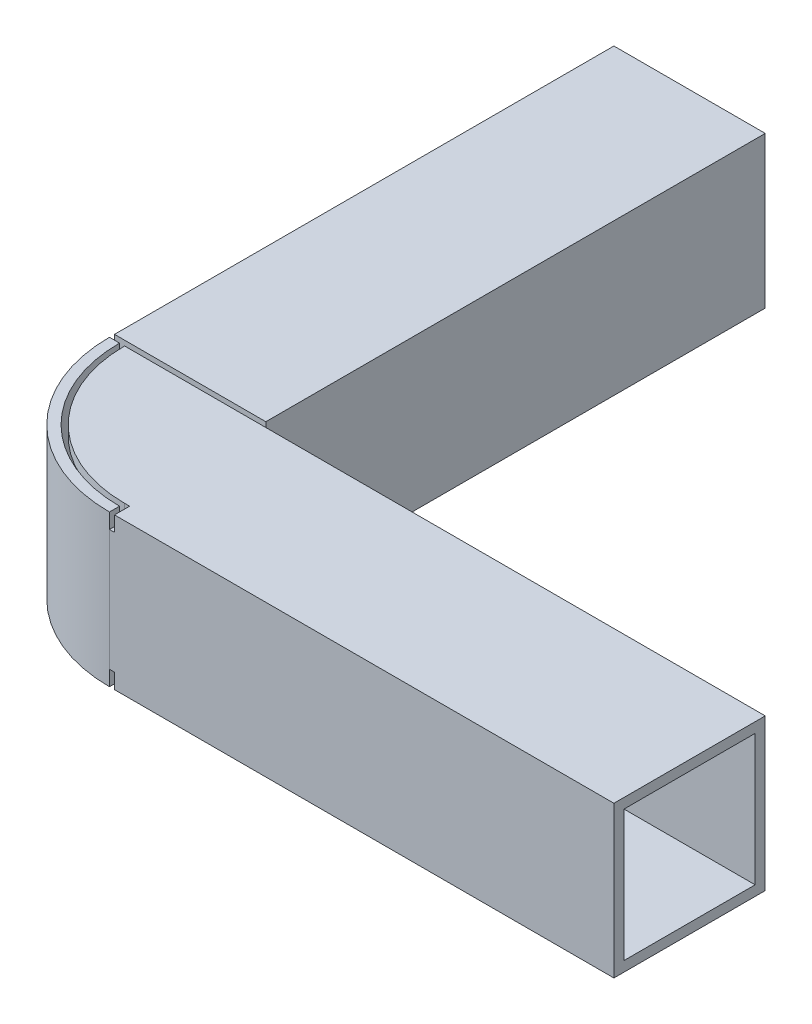
ISO-10303-21;
HEADER;
FILE_DESCRIPTION(('STEP AP214'),'2;1');
FILE_NAME('part.step','',(''),(''),'','','');
FILE_SCHEMA(('AUTOMOTIVE_DESIGN { 1 0 10303 214 1 1 1 1 }'));
ENDSEC;
DATA;
#1=APPLICATION_CONTEXT('core data for automotive mechanical design processes');
#2=APPLICATION_PROTOCOL_DEFINITION('international standard','automotive_design',2000,#1);
#3=PRODUCT_CONTEXT('',#1,'mechanical');
#4=PRODUCT('Part','Part','',(#3));
#5=PRODUCT_RELATED_PRODUCT_CATEGORY('part','',(#4));
#6=PRODUCT_DEFINITION_FORMATION('','',#4);
#7=PRODUCT_DEFINITION_CONTEXT('part definition',#1,'design');
#8=PRODUCT_DEFINITION('design','',#6,#7);
#9=PRODUCT_DEFINITION_SHAPE('','',#8);
#10=(LENGTH_UNIT() NAMED_UNIT(*) SI_UNIT(.MILLI.,.METRE.));
#11=(NAMED_UNIT(*) PLANE_ANGLE_UNIT() SI_UNIT($,.RADIAN.));
#12=(NAMED_UNIT(*) SI_UNIT($,.STERADIAN.) SOLID_ANGLE_UNIT());
#13=UNCERTAINTY_MEASURE_WITH_UNIT(LENGTH_MEASURE(1.E-05),#10,'distance_accuracy_value','');
#14=(GEOMETRIC_REPRESENTATION_CONTEXT(3) GLOBAL_UNCERTAINTY_ASSIGNED_CONTEXT((#13)) GLOBAL_UNIT_ASSIGNED_CONTEXT((#10,
#11,#12)) REPRESENTATION_CONTEXT('',''));
#15=CARTESIAN_POINT('',(0.,0.,0.));
#16=DIRECTION('',(0.,0.,1.));
#17=DIRECTION('',(1.,0.,0.));
#18=AXIS2_PLACEMENT_3D('',#15,#16,#17);
#19=CARTESIAN_POINT('',(-30.,15.,0.));
#20=DIRECTION('',(-1.,0.,0.));
#21=DIRECTION('',(0.,0.,1.));
#22=AXIS2_PLACEMENT_3D('',#19,#20,#21);
#23=PLANE('',#22);
#24=DIRECTION('',(0.,0.,-1.));
#25=VECTOR('',#24,1.);
#26=CARTESIAN_POINT('',(-30.,-15.,0.));
#27=LINE('',#26,#25);
#28=CARTESIAN_POINT('',(-30.,-15.,-0.999999999999996));
#29=VERTEX_POINT('',#28);
#30=CARTESIAN_POINT('',(-30.,-15.,-100.));
#31=VERTEX_POINT('',#30);
#32=EDGE_CURVE('E220',#29,#31,#27,.T.);
#33=ORIENTED_EDGE('',*,*,#32,.F.);
#34=DIRECTION('',(0.,-1.,0.));
#35=VECTOR('',#34,1.);
#36=CARTESIAN_POINT('',(-30.,-12.,-0.999999999999996));
#37=LINE('',#36,#35);
#38=CARTESIAN_POINT('',(-30.,-12.,-0.999999999999996));
#39=VERTEX_POINT('',#38);
#40=EDGE_CURVE('E571',#39,#29,#37,.T.);
#41=ORIENTED_EDGE('',*,*,#40,.F.);
#42=DIRECTION('',(0.,0.,1.));
#43=VECTOR('',#42,1.);
#44=CARTESIAN_POINT('',(-30.,-12.,0.));
#45=LINE('',#44,#43);
#46=CARTESIAN_POINT('',(-30.,-12.,0.));
#47=VERTEX_POINT('',#46);
#48=EDGE_CURVE('E546',#39,#47,#45,.T.);
#49=ORIENTED_EDGE('',*,*,#48,.T.);
#50=DIRECTION('',(0.,-1.,0.));
#51=VECTOR('',#50,1.);
#52=CARTESIAN_POINT('',(-30.,15.,0.));
#53=LINE('',#52,#51);
#54=CARTESIAN_POINT('',(-30.,12.,0.));
#55=VERTEX_POINT('',#54);
#56=EDGE_CURVE('E245',#47,#55,#53,.F.);
#57=ORIENTED_EDGE('',*,*,#56,.T.);
#58=DIRECTION('',(0.,0.,1.));
#59=VECTOR('',#58,1.);
#60=CARTESIAN_POINT('',(-30.,12.,0.));
#61=LINE('',#60,#59);
#62=CARTESIAN_POINT('',(-30.,12.,-0.999999999999996));
#63=VERTEX_POINT('',#62);
#64=EDGE_CURVE('E377',#63,#55,#61,.T.);
#65=ORIENTED_EDGE('',*,*,#64,.F.);
#66=DIRECTION('',(0.,1.,0.));
#67=VECTOR('',#66,1.);
#68=CARTESIAN_POINT('',(-30.,12.,-0.999999999999996));
#69=LINE('',#68,#67);
#70=CARTESIAN_POINT('',(-30.,15.,-0.999999999999996));
#71=VERTEX_POINT('',#70);
#72=EDGE_CURVE('E393',#63,#71,#69,.T.);
#73=ORIENTED_EDGE('',*,*,#72,.T.);
#74=DIRECTION('',(0.,0.,-1.));
#75=VECTOR('',#74,1.);
#76=CARTESIAN_POINT('',(-30.,15.,0.));
#77=LINE('',#76,#75);
#78=CARTESIAN_POINT('',(-30.,15.,-100.));
#79=VERTEX_POINT('',#78);
#80=EDGE_CURVE('E204',#71,#79,#77,.T.);
#81=ORIENTED_EDGE('',*,*,#80,.T.);
#82=DIRECTION('',(0.,-1.,0.));
#83=VECTOR('',#82,1.);
#84=CARTESIAN_POINT('',(-30.,15.,-100.));
#85=LINE('',#84,#83);
#86=EDGE_CURVE('E232',#79,#31,#85,.T.);
#87=ORIENTED_EDGE('',*,*,#86,.T.);
#88=EDGE_LOOP('',(#33,#41,#49,#57,#65,#73,#81,#87));
#89=FACE_BOUND('',#88,.T.);
#90=ADVANCED_FACE('F37',(#89),#23,.T.);
#91=CARTESIAN_POINT('',(0.,15.,30.));
#92=DIRECTION('',(0.,0.,1.));
#93=DIRECTION('',(1.,0.,0.));
#94=AXIS2_PLACEMENT_3D('',#91,#92,#93);
#95=PLANE('',#94);
#96=DIRECTION('',(1.,0.,0.));
#97=VECTOR('',#96,1.);
#98=CARTESIAN_POINT('',(1.,-12.,30.));
#99=LINE('',#98,#97);
#100=CARTESIAN_POINT('',(0.,-12.,30.));
#101=VERTEX_POINT('',#100);
#102=CARTESIAN_POINT('',(1.,-12.,30.));
#103=VERTEX_POINT('',#102);
#104=EDGE_CURVE('E360',#101,#103,#99,.T.);
#105=ORIENTED_EDGE('',*,*,#104,.T.);
#106=DIRECTION('',(0.,-1.,0.));
#107=VECTOR('',#106,1.);
#108=CARTESIAN_POINT('',(1.,-12.,30.));
#109=LINE('',#108,#107);
#110=CARTESIAN_POINT('',(1.,-15.,30.));
#111=VERTEX_POINT('',#110);
#112=EDGE_CURVE('E353',#103,#111,#109,.T.);
#113=ORIENTED_EDGE('',*,*,#112,.T.);
#114=DIRECTION('',(1.,0.,0.));
#115=VECTOR('',#114,1.);
#116=CARTESIAN_POINT('',(0.,-15.,30.));
#117=LINE('',#116,#115);
#118=CARTESIAN_POINT('',(100.,-15.,30.));
#119=VERTEX_POINT('',#118);
#120=EDGE_CURVE('E222',#119,#111,#117,.F.);
#121=ORIENTED_EDGE('',*,*,#120,.F.);
#122=DIRECTION('',(0.,-1.,0.));
#123=VECTOR('',#122,1.);
#124=CARTESIAN_POINT('',(100.,15.,30.));
#125=LINE('',#124,#123);
#126=CARTESIAN_POINT('',(100.,15.,30.));
#127=VERTEX_POINT('',#126);
#128=EDGE_CURVE('E230',#127,#119,#125,.T.);
#129=ORIENTED_EDGE('',*,*,#128,.F.);
#130=DIRECTION('',(1.,0.,0.));
#131=VECTOR('',#130,1.);
#132=CARTESIAN_POINT('',(0.,15.,30.));
#133=LINE('',#132,#131);
#134=CARTESIAN_POINT('',(1.,15.,30.));
#135=VERTEX_POINT('',#134);
#136=EDGE_CURVE('E206',#127,#135,#133,.F.);
#137=ORIENTED_EDGE('',*,*,#136,.T.);
#138=DIRECTION('',(0.,1.,0.));
#139=VECTOR('',#138,1.);
#140=CARTESIAN_POINT('',(1.,12.,30.));
#141=LINE('',#140,#139);
#142=CARTESIAN_POINT('',(1.,12.,30.));
#143=VERTEX_POINT('',#142);
#144=EDGE_CURVE('E407',#143,#135,#141,.T.);
#145=ORIENTED_EDGE('',*,*,#144,.F.);
#146=DIRECTION('',(1.,0.,0.));
#147=VECTOR('',#146,1.);
#148=CARTESIAN_POINT('',(1.,12.,30.));
#149=LINE('',#148,#147);
#150=CARTESIAN_POINT('',(0.,12.,30.));
#151=VERTEX_POINT('',#150);
#152=EDGE_CURVE('E400',#151,#143,#149,.T.);
#153=ORIENTED_EDGE('',*,*,#152,.F.);
#154=DIRECTION('',(0.,-1.,0.));
#155=VECTOR('',#154,1.);
#156=CARTESIAN_POINT('',(0.,15.,30.));
#157=LINE('',#156,#155);
#158=EDGE_CURVE('E238',#151,#101,#157,.T.);
#159=ORIENTED_EDGE('',*,*,#158,.T.);
#160=EDGE_LOOP('',(#105,#113,#121,#129,#137,#145,#153,#159));
#161=FACE_BOUND('',#160,.T.);
#162=ADVANCED_FACE('F587',(#161),#95,.T.);
#163=CARTESIAN_POINT('',(0.,-15.,0.));
#164=DIRECTION('',(0.,-1.,0.));
#165=DIRECTION('',(-1.,0.,0.));
#166=AXIS2_PLACEMENT_3D('',#163,#164,#165);
#167=PLANE('',#166);
#168=DIRECTION('',(-1.,0.,0.));
#169=VECTOR('',#168,1.);
#170=CARTESIAN_POINT('',(0.,-15.,-1.));
#171=LINE('',#170,#169);
#172=CARTESIAN_POINT('',(0.,-15.,-0.999999999999998));
#173=VERTEX_POINT('',#172);
#174=EDGE_CURVE('E427',#173,#29,#171,.T.);
#175=ORIENTED_EDGE('',*,*,#174,.T.);
#176=ORIENTED_EDGE('',*,*,#32,.T.);
#177=DIRECTION('',(1.,0.,0.));
#178=VECTOR('',#177,1.);
#179=CARTESIAN_POINT('',(-30.,-15.,-100.));
#180=LINE('',#179,#178);
#181=CARTESIAN_POINT('',(0.,-15.,-100.));
#182=VERTEX_POINT('',#181);
#183=EDGE_CURVE('E216',#31,#182,#180,.T.);
#184=ORIENTED_EDGE('',*,*,#183,.T.);
#185=DIRECTION('',(0.,0.,-1.));
#186=VECTOR('',#185,1.);
#187=CARTESIAN_POINT('',(0.,-15.,0.));
#188=LINE('',#187,#186);
#189=EDGE_CURVE('E214',#173,#182,#188,.T.);
#190=ORIENTED_EDGE('',*,*,#189,.F.);
#191=EDGE_LOOP('',(#175,#176,#184,#190));
#192=FACE_BOUND('',#191,.T.);
#193=ADVANCED_FACE('F616',(#192),#167,.T.);
#194=CARTESIAN_POINT('',(0.,-15.,0.));
#195=DIRECTION('',(0.,-1.,0.));
#196=DIRECTION('',(0.,0.,-1.));
#197=AXIS2_PLACEMENT_3D('',#194,#195,#196);
#198=CIRCLE('',#197,30.);
#199=CARTESIAN_POINT('',(0.,-15.,30.));
#200=VERTEX_POINT('',#199);
#201=CARTESIAN_POINT('',(-30.,-15.,0.));
#202=VERTEX_POINT('',#201);
#203=EDGE_CURVE('E242',#200,#202,#198,.T.);
#204=ORIENTED_EDGE('',*,*,#203,.T.);
#205=DIRECTION('',(1.,0.,0.));
#206=VECTOR('',#205,1.);
#207=CARTESIAN_POINT('',(-28.,-15.,0.));
#208=LINE('',#207,#206);
#209=CARTESIAN_POINT('',(-28.,-15.,0.));
#210=VERTEX_POINT('',#209);
#211=EDGE_CURVE('E553',#202,#210,#208,.T.);
#212=ORIENTED_EDGE('',*,*,#211,.T.);
#213=CARTESIAN_POINT('',(0.,-15.,0.));
#214=DIRECTION('',(0.,1.,0.));
#215=DIRECTION('',(0.,0.,1.));
#216=AXIS2_PLACEMENT_3D('',#213,#214,#215);
#217=CIRCLE('',#216,28.);
#218=CARTESIAN_POINT('',(1.88542757795229E-13,-15.,28.));
#219=VERTEX_POINT('',#218);
#220=EDGE_CURVE('E430',#210,#219,#217,.T.);
#221=ORIENTED_EDGE('',*,*,#220,.T.);
#222=DIRECTION('',(0.,0.,1.));
#223=VECTOR('',#222,1.);
#224=CARTESIAN_POINT('',(0.,-15.,30.));
#225=LINE('',#224,#223);
#226=EDGE_CURVE('E564',#219,#200,#225,.T.);
#227=ORIENTED_EDGE('',*,*,#226,.T.);
#228=EDGE_LOOP('',(#204,#212,#221,#227));
#229=FACE_BOUND('',#228,.T.);
#230=ADVANCED_FACE('F563',(#229),#167,.T.);
#231=DIRECTION('',(0.,0.,-1.));
#232=VECTOR('',#231,1.);
#233=CARTESIAN_POINT('',(0.999999999999999,-15.,27.));
#234=LINE('',#233,#232);
#235=CARTESIAN_POINT('',(0.999999999999999,-15.,27.));
#236=VERTEX_POINT('',#235);
#237=EDGE_CURVE('E579',#111,#236,#234,.T.);
#238=ORIENTED_EDGE('',*,*,#237,.T.);
#239=DIRECTION('',(-1.,0.,0.));
#240=VECTOR('',#239,1.);
#241=CARTESIAN_POINT('',(2.82814136692844E-13,-15.,27.));
#242=LINE('',#241,#240);
#243=CARTESIAN_POINT('',(2.82814136692844E-13,-15.,27.));
#244=VERTEX_POINT('',#243);
#245=EDGE_CURVE('E351',#236,#244,#242,.T.);
#246=ORIENTED_EDGE('',*,*,#245,.T.);
#247=CARTESIAN_POINT('',(0.,-15.,0.));
#248=DIRECTION('',(0.,1.,0.));
#249=DIRECTION('',(0.,0.,1.));
#250=AXIS2_PLACEMENT_3D('',#247,#248,#249);
#251=CIRCLE('',#250,27.);
#252=CARTESIAN_POINT('',(-27.,-15.,0.));
#253=VERTEX_POINT('',#252);
#254=EDGE_CURVE('E424',#253,#244,#251,.T.);
#255=ORIENTED_EDGE('',*,*,#254,.F.);
#256=DIRECTION('',(-1.,0.,0.));
#257=VECTOR('',#256,1.);
#258=CARTESIAN_POINT('',(0.,-15.,0.));
#259=LINE('',#258,#257);
#260=CARTESIAN_POINT('',(100.,-15.,0.));
#261=VERTEX_POINT('',#260);
#262=EDGE_CURVE('E201',#261,#253,#259,.T.);
#263=ORIENTED_EDGE('',*,*,#262,.F.);
#264=DIRECTION('',(0.,0.,1.));
#265=VECTOR('',#264,1.);
#266=CARTESIAN_POINT('',(100.,-15.,0.));
#267=LINE('',#266,#265);
#268=EDGE_CURVE('E225',#261,#119,#267,.T.);
#269=ORIENTED_EDGE('',*,*,#268,.T.);
#270=ORIENTED_EDGE('',*,*,#120,.T.);
#271=EDGE_LOOP('',(#238,#246,#255,#263,#269,#270));
#272=FACE_BOUND('',#271,.T.);
#273=ADVANCED_FACE('F582',(#272),#167,.T.);
#274=CARTESIAN_POINT('',(-28.,15.,0.));
#275=DIRECTION('',(-1.,0.,0.));
#276=DIRECTION('',(0.,0.,1.));
#277=AXIS2_PLACEMENT_3D('',#274,#275,#276);
#278=PLANE('',#277);
#279=DIRECTION('',(0.,-1.,0.));
#280=VECTOR('',#279,1.);
#281=CARTESIAN_POINT('',(-28.,-12.,-0.999999999999997));
#282=LINE('',#281,#280);
#283=CARTESIAN_POINT('',(-28.,-12.,-0.999999999999997));
#284=VERTEX_POINT('',#283);
#285=CARTESIAN_POINT('',(-28.,-13.,-0.999999999999997));
#286=VERTEX_POINT('',#285);
#287=EDGE_CURVE('E366',#284,#286,#282,.T.);
#288=ORIENTED_EDGE('',*,*,#287,.T.);
#289=DIRECTION('',(0.,0.,-1.));
#290=VECTOR('',#289,1.);
#291=CARTESIAN_POINT('',(-28.,-13.,0.));
#292=LINE('',#291,#290);
#293=CARTESIAN_POINT('',(-28.,-13.,-100.));
#294=VERTEX_POINT('',#293);
#295=EDGE_CURVE('E292',#286,#294,#292,.T.);
#296=ORIENTED_EDGE('',*,*,#295,.T.);
#297=DIRECTION('',(0.,-1.,0.));
#298=VECTOR('',#297,1.);
#299=CARTESIAN_POINT('',(-28.,15.,-100.));
#300=LINE('',#299,#298);
#301=CARTESIAN_POINT('',(-28.,13.,-100.));
#302=VERTEX_POINT('',#301);
#303=EDGE_CURVE('E186',#302,#294,#300,.T.);
#304=ORIENTED_EDGE('',*,*,#303,.F.);
#305=DIRECTION('',(0.,0.,-1.));
#306=VECTOR('',#305,1.);
#307=CARTESIAN_POINT('',(-28.,13.,0.));
#308=LINE('',#307,#306);
#309=CARTESIAN_POINT('',(-28.,13.,-0.999999999999997));
#310=VERTEX_POINT('',#309);
#311=EDGE_CURVE('E180',#310,#302,#308,.T.);
#312=ORIENTED_EDGE('',*,*,#311,.F.);
#313=DIRECTION('',(0.,1.,0.));
#314=VECTOR('',#313,1.);
#315=CARTESIAN_POINT('',(-28.,12.,-0.999999999999997));
#316=LINE('',#315,#314);
#317=CARTESIAN_POINT('',(-28.,12.,-0.999999999999997));
#318=VERTEX_POINT('',#317);
#319=EDGE_CURVE('E383',#318,#310,#316,.T.);
#320=ORIENTED_EDGE('',*,*,#319,.F.);
#321=DIRECTION('',(0.,0.,-1.));
#322=VECTOR('',#321,1.);
#323=CARTESIAN_POINT('',(-28.,12.,-0.999999999999997));
#324=LINE('',#323,#322);
#325=CARTESIAN_POINT('',(-28.,12.,0.));
#326=VERTEX_POINT('',#325);
#327=EDGE_CURVE('E370',#326,#318,#324,.T.);
#328=ORIENTED_EDGE('',*,*,#327,.F.);
#329=DIRECTION('',(0.,1.,0.));
#330=VECTOR('',#329,1.);
#331=CARTESIAN_POINT('',(-28.,15.,0.));
#332=LINE('',#331,#330);
#333=CARTESIAN_POINT('',(-28.,-12.,0.));
#334=VERTEX_POINT('',#333);
#335=EDGE_CURVE('E269',#334,#326,#332,.T.);
#336=ORIENTED_EDGE('',*,*,#335,.F.);
#337=DIRECTION('',(0.,0.,-1.));
#338=VECTOR('',#337,1.);
#339=CARTESIAN_POINT('',(-28.,-12.,-0.999999999999997));
#340=LINE('',#339,#338);
#341=EDGE_CURVE('E547',#334,#284,#340,.T.);
#342=ORIENTED_EDGE('',*,*,#341,.T.);
#343=EDGE_LOOP('',(#288,#296,#304,#312,#320,#328,#336,#342));
#344=FACE_BOUND('',#343,.T.);
#345=ADVANCED_FACE('F556',(#344),#278,.F.);
#346=CARTESIAN_POINT('',(0.,15.,28.));
#347=DIRECTION('',(0.,0.,1.));
#348=DIRECTION('',(1.,0.,0.));
#349=AXIS2_PLACEMENT_3D('',#346,#347,#348);
#350=PLANE('',#349);
#351=DIRECTION('',(0.,-1.,0.));
#352=VECTOR('',#351,1.);
#353=CARTESIAN_POINT('',(1.,15.,28.));
#354=LINE('',#353,#352);
#355=CARTESIAN_POINT('',(1.,-12.,28.));
#356=VERTEX_POINT('',#355);
#357=CARTESIAN_POINT('',(1.,-13.,28.));
#358=VERTEX_POINT('',#357);
#359=EDGE_CURVE('E324',#356,#358,#354,.T.);
#360=ORIENTED_EDGE('',*,*,#359,.F.);
#361=DIRECTION('',(-1.,0.,0.));
#362=VECTOR('',#361,1.);
#363=CARTESIAN_POINT('',(0.,-12.,28.));
#364=LINE('',#363,#362);
#365=CARTESIAN_POINT('',(1.88542757795229E-13,-12.,28.));
#366=VERTEX_POINT('',#365);
#367=EDGE_CURVE('E365',#356,#366,#364,.T.);
#368=ORIENTED_EDGE('',*,*,#367,.T.);
#369=DIRECTION('',(0.,1.,0.));
#370=VECTOR('',#369,1.);
#371=CARTESIAN_POINT('',(0.,15.,28.));
#372=LINE('',#371,#370);
#373=CARTESIAN_POINT('',(1.88542757795229E-13,12.,28.));
#374=VERTEX_POINT('',#373);
#375=EDGE_CURVE('E281',#374,#366,#372,.F.);
#376=ORIENTED_EDGE('',*,*,#375,.F.);
#377=DIRECTION('',(1.,0.,0.));
#378=VECTOR('',#377,1.);
#379=CARTESIAN_POINT('',(0.,12.,28.));
#380=LINE('',#379,#378);
#381=CARTESIAN_POINT('',(1.,12.,28.));
#382=VERTEX_POINT('',#381);
#383=EDGE_CURVE('E421',#374,#382,#380,.T.);
#384=ORIENTED_EDGE('',*,*,#383,.T.);
#385=DIRECTION('',(0.,1.,0.));
#386=VECTOR('',#385,1.);
#387=CARTESIAN_POINT('',(1.,15.,28.));
#388=LINE('',#387,#386);
#389=CARTESIAN_POINT('',(1.,13.,28.));
#390=VERTEX_POINT('',#389);
#391=EDGE_CURVE('E179',#382,#390,#388,.T.);
#392=ORIENTED_EDGE('',*,*,#391,.T.);
#393=DIRECTION('',(-1.,0.,0.));
#394=VECTOR('',#393,1.);
#395=CARTESIAN_POINT('',(0.,13.,28.));
#396=LINE('',#395,#394);
#397=CARTESIAN_POINT('',(100.,13.,28.));
#398=VERTEX_POINT('',#397);
#399=EDGE_CURVE('E165',#398,#390,#396,.T.);
#400=ORIENTED_EDGE('',*,*,#399,.F.);
#401=DIRECTION('',(0.,-1.,0.));
#402=VECTOR('',#401,1.);
#403=CARTESIAN_POINT('',(100.,15.,28.));
#404=LINE('',#403,#402);
#405=CARTESIAN_POINT('',(100.,-13.,28.));
#406=VERTEX_POINT('',#405);
#407=EDGE_CURVE('E176',#398,#406,#404,.T.);
#408=ORIENTED_EDGE('',*,*,#407,.T.);
#409=DIRECTION('',(-1.,0.,0.));
#410=VECTOR('',#409,1.);
#411=CARTESIAN_POINT('',(0.,-13.,28.));
#412=LINE('',#411,#410);
#413=EDGE_CURVE('E197',#406,#358,#412,.T.);
#414=ORIENTED_EDGE('',*,*,#413,.T.);
#415=EDGE_LOOP('',(#360,#368,#376,#384,#392,#400,#408,#414));
#416=FACE_BOUND('',#415,.T.);
#417=ADVANCED_FACE('F174',(#416),#350,.F.);
#418=CARTESIAN_POINT('',(0.,-13.,0.));
#419=DIRECTION('',(0.,-1.,0.));
#420=DIRECTION('',(-1.,0.,0.));
#421=AXIS2_PLACEMENT_3D('',#418,#419,#420);
#422=PLANE('',#421);
#423=DIRECTION('',(-1.,0.,0.));
#424=VECTOR('',#423,1.);
#425=CARTESIAN_POINT('',(0.,-13.,27.));
#426=LINE('',#425,#424);
#427=CARTESIAN_POINT('',(0.999999999999999,-13.,27.));
#428=VERTEX_POINT('',#427);
#429=CARTESIAN_POINT('',(1.33915127486763E-13,-13.,27.));
#430=VERTEX_POINT('',#429);
#431=EDGE_CURVE('E333',#428,#430,#426,.T.);
#432=ORIENTED_EDGE('',*,*,#431,.F.);
#433=DIRECTION('',(0.,0.,-1.));
#434=VECTOR('',#433,1.);
#435=CARTESIAN_POINT('',(0.999999999999995,-13.,0.));
#436=LINE('',#435,#434);
#437=EDGE_CURVE('E11',#358,#428,#436,.T.);
#438=ORIENTED_EDGE('',*,*,#437,.F.);
#439=ORIENTED_EDGE('',*,*,#413,.F.);
#440=DIRECTION('',(0.,0.,1.));
#441=VECTOR('',#440,1.);
#442=CARTESIAN_POINT('',(100.,-13.,0.));
#443=LINE('',#442,#441);
#444=CARTESIAN_POINT('',(100.,-13.,2.));
#445=VERTEX_POINT('',#444);
#446=EDGE_CURVE('E185',#445,#406,#443,.T.);
#447=ORIENTED_EDGE('',*,*,#446,.F.);
#448=DIRECTION('',(-1.,0.,0.));
#449=VECTOR('',#448,1.);
#450=CARTESIAN_POINT('',(0.,-13.,2.));
#451=LINE('',#450,#449);
#452=CARTESIAN_POINT('',(-2.,-13.,2.));
#453=VERTEX_POINT('',#452);
#454=EDGE_CURVE('E196',#445,#453,#451,.T.);
#455=ORIENTED_EDGE('',*,*,#454,.T.);
#456=DIRECTION('',(0.,0.,-1.));
#457=VECTOR('',#456,1.);
#458=CARTESIAN_POINT('',(-2.,-13.,0.));
#459=LINE('',#458,#457);
#460=CARTESIAN_POINT('',(-2.,-13.,0.));
#461=VERTEX_POINT('',#460);
#462=EDGE_CURVE('E293',#453,#461,#459,.T.);
#463=ORIENTED_EDGE('',*,*,#462,.T.);
#464=DIRECTION('',(1.,0.,0.));
#465=VECTOR('',#464,1.);
#466=CARTESIAN_POINT('',(0.,-13.,0.));
#467=LINE('',#466,#465);
#468=CARTESIAN_POINT('',(-27.,-13.,0.));
#469=VERTEX_POINT('',#468);
#470=EDGE_CURVE('E252',#469,#461,#467,.T.);
#471=ORIENTED_EDGE('',*,*,#470,.F.);
#472=CARTESIAN_POINT('',(0.,-13.,0.));
#473=DIRECTION('',(0.,-1.,0.));
#474=DIRECTION('',(0.,0.,-1.));
#475=AXIS2_PLACEMENT_3D('',#472,#473,#474);
#476=CIRCLE('',#475,27.);
#477=EDGE_CURVE('E254',#430,#469,#476,.T.);
#478=ORIENTED_EDGE('',*,*,#477,.F.);
#479=EDGE_LOOP('',(#432,#438,#439,#447,#455,#463,#471,#478));
#480=FACE_BOUND('',#479,.T.);
#481=ADVANCED_FACE('F330',(#480),#422,.F.);
#482=CARTESIAN_POINT('',(0.,15.,0.));
#483=DIRECTION('',(0.,-1.,0.));
#484=DIRECTION('',(-1.,0.,0.));
#485=AXIS2_PLACEMENT_3D('',#482,#483,#484);
#486=PLANE('',#485);
#487=CARTESIAN_POINT('',(0.,15.,0.));
#488=DIRECTION('',(0.,1.,0.));
#489=DIRECTION('',(0.,0.,1.));
#490=AXIS2_PLACEMENT_3D('',#487,#488,#489);
#491=CIRCLE('',#490,28.);
#492=CARTESIAN_POINT('',(-28.,15.,0.));
#493=VERTEX_POINT('',#492);
#494=CARTESIAN_POINT('',(1.88542757795229E-13,15.,28.));
#495=VERTEX_POINT('',#494);
#496=EDGE_CURVE('E259',#493,#495,#491,.T.);
#497=ORIENTED_EDGE('',*,*,#496,.F.);
#498=DIRECTION('',(1.,0.,0.));
#499=VECTOR('',#498,1.);
#500=CARTESIAN_POINT('',(-28.,15.,0.));
#501=LINE('',#500,#499);
#502=CARTESIAN_POINT('',(-30.,15.,0.));
#503=VERTEX_POINT('',#502);
#504=EDGE_CURVE('E374',#503,#493,#501,.T.);
#505=ORIENTED_EDGE('',*,*,#504,.F.);
#506=CARTESIAN_POINT('',(0.,15.,0.));
#507=DIRECTION('',(0.,-1.,0.));
#508=DIRECTION('',(0.,0.,-1.));
#509=AXIS2_PLACEMENT_3D('',#506,#507,#508);
#510=CIRCLE('',#509,30.);
#511=CARTESIAN_POINT('',(0.,15.,30.));
#512=VERTEX_POINT('',#511);
#513=EDGE_CURVE('E249',#503,#512,#510,.F.);
#514=ORIENTED_EDGE('',*,*,#513,.T.);
#515=DIRECTION('',(0.,0.,1.));
#516=VECTOR('',#515,1.);
#517=CARTESIAN_POINT('',(0.,15.,30.));
#518=LINE('',#517,#516);
#519=EDGE_CURVE('E410',#495,#512,#518,.T.);
#520=ORIENTED_EDGE('',*,*,#519,.F.);
#521=EDGE_LOOP('',(#497,#505,#514,#520));
#522=FACE_BOUND('',#521,.T.);
#523=ADVANCED_FACE('F658',(#522),#486,.F.);
#524=CARTESIAN_POINT('',(0.,15.,0.));
#525=DIRECTION('',(0.,1.,0.));
#526=DIRECTION('',(0.,0.,1.));
#527=AXIS2_PLACEMENT_3D('',#524,#525,#526);
#528=CIRCLE('',#527,27.);
#529=CARTESIAN_POINT('',(-27.,15.,0.));
#530=VERTEX_POINT('',#529);
#531=CARTESIAN_POINT('',(1.33915127486763E-13,15.,27.));
#532=VERTEX_POINT('',#531);
#533=EDGE_CURVE('E264',#530,#532,#528,.T.);
#534=ORIENTED_EDGE('',*,*,#533,.T.);
#535=DIRECTION('',(-1.,0.,0.));
#536=VECTOR('',#535,1.);
#537=CARTESIAN_POINT('',(2.82814136692844E-13,15.,27.));
#538=LINE('',#537,#536);
#539=CARTESIAN_POINT('',(0.999999999999999,15.,27.));
#540=VERTEX_POINT('',#539);
#541=EDGE_CURVE('E369',#540,#532,#538,.T.);
#542=ORIENTED_EDGE('',*,*,#541,.F.);
#543=DIRECTION('',(0.,0.,-1.));
#544=VECTOR('',#543,1.);
#545=CARTESIAN_POINT('',(0.999999999999999,15.,27.));
#546=LINE('',#545,#544);
#547=EDGE_CURVE('E401',#135,#540,#546,.T.);
#548=ORIENTED_EDGE('',*,*,#547,.F.);
#549=ORIENTED_EDGE('',*,*,#136,.F.);
#550=DIRECTION('',(0.,0.,1.));
#551=VECTOR('',#550,1.);
#552=CARTESIAN_POINT('',(100.,15.,0.));
#553=LINE('',#552,#551);
#554=CARTESIAN_POINT('',(100.,15.,0.));
#555=VERTEX_POINT('',#554);
#556=EDGE_CURVE('E209',#555,#127,#553,.T.);
#557=ORIENTED_EDGE('',*,*,#556,.F.);
#558=DIRECTION('',(-1.,0.,0.));
#559=VECTOR('',#558,1.);
#560=CARTESIAN_POINT('',(0.,15.,0.));
#561=LINE('',#560,#559);
#562=EDGE_CURVE('E68',#555,#530,#561,.T.);
#563=ORIENTED_EDGE('',*,*,#562,.T.);
#564=EDGE_LOOP('',(#534,#542,#548,#549,#557,#563));
#565=FACE_BOUND('',#564,.T.);
#566=ADVANCED_FACE('F670',(#565),#486,.F.);
#567=CARTESIAN_POINT('',(-2.,15.,0.));
#568=DIRECTION('',(-1.,0.,0.));
#569=DIRECTION('',(0.,0.,1.));
#570=AXIS2_PLACEMENT_3D('',#567,#568,#569);
#571=PLANE('',#570);
#572=DIRECTION('',(0.,0.,-1.));
#573=VECTOR('',#572,1.);
#574=CARTESIAN_POINT('',(-2.,13.,0.));
#575=LINE('',#574,#573);
#576=CARTESIAN_POINT('',(-2.,13.,2.));
#577=VERTEX_POINT('',#576);
#578=CARTESIAN_POINT('',(-2.,13.,0.));
#579=VERTEX_POINT('',#578);
#580=EDGE_CURVE('E297',#577,#579,#575,.T.);
#581=ORIENTED_EDGE('',*,*,#580,.T.);
#582=DIRECTION('',(0.,-1.,0.));
#583=VECTOR('',#582,1.);
#584=CARTESIAN_POINT('',(-2.,15.,0.));
#585=LINE('',#584,#583);
#586=EDGE_CURVE('E442',#579,#461,#585,.T.);
#587=ORIENTED_EDGE('',*,*,#586,.T.);
#588=ORIENTED_EDGE('',*,*,#462,.F.);
#589=DIRECTION('',(0.,-1.,0.));
#590=VECTOR('',#589,1.);
#591=CARTESIAN_POINT('',(-2.,15.,2.));
#592=LINE('',#591,#590);
#593=EDGE_CURVE('E192',#577,#453,#592,.T.);
#594=ORIENTED_EDGE('',*,*,#593,.F.);
#595=EDGE_LOOP('',(#581,#587,#588,#594));
#596=FACE_BOUND('',#595,.T.);
#597=ADVANCED_FACE('F695',(#596),#571,.T.);
#598=CARTESIAN_POINT('',(0.,13.,0.));
#599=DIRECTION('',(0.,-1.,0.));
#600=DIRECTION('',(-1.,0.,0.));
#601=AXIS2_PLACEMENT_3D('',#598,#599,#600);
#602=PLANE('',#601);
#603=DIRECTION('',(1.,0.,0.));
#604=VECTOR('',#603,1.);
#605=CARTESIAN_POINT('',(0.,13.,-1.));
#606=LINE('',#605,#604);
#607=CARTESIAN_POINT('',(-2.,13.,-1.));
#608=VERTEX_POINT('',#607);
#609=EDGE_CURVE('E452',#310,#608,#606,.T.);
#610=ORIENTED_EDGE('',*,*,#609,.F.);
#611=ORIENTED_EDGE('',*,*,#311,.T.);
#612=DIRECTION('',(1.,0.,0.));
#613=VECTOR('',#612,1.);
#614=CARTESIAN_POINT('',(0.,13.,-100.));
#615=LINE('',#614,#613);
#616=CARTESIAN_POINT('',(-2.,13.,-100.));
#617=VERTEX_POINT('',#616);
#618=EDGE_CURVE('E295',#302,#617,#615,.T.);
#619=ORIENTED_EDGE('',*,*,#618,.T.);
#620=EDGE_CURVE('E304',#608,#617,#575,.T.);
#621=ORIENTED_EDGE('',*,*,#620,.F.);
#622=EDGE_LOOP('',(#610,#611,#619,#621));
#623=FACE_BOUND('',#622,.T.);
#624=ADVANCED_FACE('F705',(#623),#602,.T.);
#625=ORIENTED_EDGE('',*,*,#295,.F.);
#626=DIRECTION('',(1.,0.,0.));
#627=VECTOR('',#626,1.);
#628=CARTESIAN_POINT('',(0.,-13.,-1.));
#629=LINE('',#628,#627);
#630=CARTESIAN_POINT('',(-2.,-13.,-1.));
#631=VERTEX_POINT('',#630);
#632=EDGE_CURVE('E256',#286,#631,#629,.T.);
#633=ORIENTED_EDGE('',*,*,#632,.T.);
#634=CARTESIAN_POINT('',(-2.,-13.,-100.));
#635=VERTEX_POINT('',#634);
#636=EDGE_CURVE('E266',#631,#635,#459,.T.);
#637=ORIENTED_EDGE('',*,*,#636,.T.);
#638=DIRECTION('',(1.,0.,0.));
#639=VECTOR('',#638,1.);
#640=CARTESIAN_POINT('',(0.,-13.,-100.));
#641=LINE('',#640,#639);
#642=EDGE_CURVE('E290',#294,#635,#641,.T.);
#643=ORIENTED_EDGE('',*,*,#642,.F.);
#644=EDGE_LOOP('',(#625,#633,#637,#643));
#645=FACE_BOUND('',#644,.T.);
#646=ADVANCED_FACE('F623',(#645),#422,.F.);
#647=CARTESIAN_POINT('',(-30.,15.,-100.));
#648=DIRECTION('',(0.,0.,-1.));
#649=DIRECTION('',(-1.,0.,0.));
#650=AXIS2_PLACEMENT_3D('',#647,#648,#649);
#651=PLANE('',#650);
#652=ORIENTED_EDGE('',*,*,#183,.F.);
#653=ORIENTED_EDGE('',*,*,#86,.F.);
#654=DIRECTION('',(1.,0.,0.));
#655=VECTOR('',#654,1.);
#656=CARTESIAN_POINT('',(-30.,15.,-100.));
#657=LINE('',#656,#655);
#658=CARTESIAN_POINT('',(0.,15.,-100.));
#659=VERTEX_POINT('',#658);
#660=EDGE_CURVE('E200',#79,#659,#657,.T.);
#661=ORIENTED_EDGE('',*,*,#660,.T.);
#662=DIRECTION('',(0.,-1.,0.));
#663=VECTOR('',#662,1.);
#664=CARTESIAN_POINT('',(0.,15.,-100.));
#665=LINE('',#664,#663);
#666=EDGE_CURVE('E235',#659,#182,#665,.T.);
#667=ORIENTED_EDGE('',*,*,#666,.T.);
#668=EDGE_LOOP('',(#652,#653,#661,#667));
#669=FACE_BOUND('',#668,.T.);
#670=ORIENTED_EDGE('',*,*,#303,.T.);
#671=ORIENTED_EDGE('',*,*,#642,.T.);
#672=DIRECTION('',(0.,-1.,0.));
#673=VECTOR('',#672,1.);
#674=CARTESIAN_POINT('',(-2.,15.,-100.));
#675=LINE('',#674,#673);
#676=EDGE_CURVE('E190',#617,#635,#675,.T.);
#677=ORIENTED_EDGE('',*,*,#676,.F.);
#678=ORIENTED_EDGE('',*,*,#618,.F.);
#679=EDGE_LOOP('',(#670,#671,#677,#678));
#680=FACE_BOUND('',#679,.T.);
#681=ADVANCED_FACE('F621',(#669,#680),#651,.T.);
#682=CARTESIAN_POINT('',(100.,15.,0.));
#683=DIRECTION('',(1.,0.,0.));
#684=DIRECTION('',(0.,0.,-1.));
#685=AXIS2_PLACEMENT_3D('',#682,#683,#684);
#686=PLANE('',#685);
#687=ORIENTED_EDGE('',*,*,#268,.F.);
#688=DIRECTION('',(0.,-1.,0.));
#689=VECTOR('',#688,1.);
#690=CARTESIAN_POINT('',(100.,15.,0.));
#691=LINE('',#690,#689);
#692=EDGE_CURVE('E213',#555,#261,#691,.T.);
#693=ORIENTED_EDGE('',*,*,#692,.F.);
#694=ORIENTED_EDGE('',*,*,#556,.T.);
#695=ORIENTED_EDGE('',*,*,#128,.T.);
#696=EDGE_LOOP('',(#687,#693,#694,#695));
#697=FACE_BOUND('',#696,.T.);
#698=DIRECTION('',(0.,-1.,0.));
#699=VECTOR('',#698,1.);
#700=CARTESIAN_POINT('',(100.,15.,2.));
#701=LINE('',#700,#699);
#702=CARTESIAN_POINT('',(100.,13.,2.));
#703=VERTEX_POINT('',#702);
#704=EDGE_CURVE('E187',#703,#445,#701,.T.);
#705=ORIENTED_EDGE('',*,*,#704,.T.);
#706=ORIENTED_EDGE('',*,*,#446,.T.);
#707=ORIENTED_EDGE('',*,*,#407,.F.);
#708=DIRECTION('',(0.,0.,1.));
#709=VECTOR('',#708,1.);
#710=CARTESIAN_POINT('',(100.,13.,0.));
#711=LINE('',#710,#709);
#712=EDGE_CURVE('E161',#703,#398,#711,.T.);
#713=ORIENTED_EDGE('',*,*,#712,.F.);
#714=EDGE_LOOP('',(#705,#706,#707,#713));
#715=FACE_BOUND('',#714,.T.);
#716=ADVANCED_FACE('F183',(#697,#715),#686,.T.);
#717=CARTESIAN_POINT('',(0.,15.,0.));
#718=DIRECTION('',(-1.,0.,0.));
#719=DIRECTION('',(0.,0.,1.));
#720=AXIS2_PLACEMENT_3D('',#717,#718,#719);
#721=PLANE('',#720);
#722=DIRECTION('',(0.,0.,-1.));
#723=VECTOR('',#722,1.);
#724=CARTESIAN_POINT('',(0.,15.,0.));
#725=LINE('',#724,#723);
#726=CARTESIAN_POINT('',(0.,15.,-0.999999999999998));
#727=VERTEX_POINT('',#726);
#728=EDGE_CURVE('E198',#727,#659,#725,.T.);
#729=ORIENTED_EDGE('',*,*,#728,.F.);
#730=DIRECTION('',(0.,1.,0.));
#731=VECTOR('',#730,1.);
#732=CARTESIAN_POINT('',(0.,-15.,-0.999999999999998));
#733=LINE('',#732,#731);
#734=EDGE_CURVE('E434',#173,#727,#733,.T.);
#735=ORIENTED_EDGE('',*,*,#734,.F.);
#736=ORIENTED_EDGE('',*,*,#189,.T.);
#737=ORIENTED_EDGE('',*,*,#666,.F.);
#738=EDGE_LOOP('',(#729,#735,#736,#737));
#739=FACE_BOUND('',#738,.T.);
#740=ADVANCED_FACE('F625',(#739),#721,.F.);
#741=CARTESIAN_POINT('',(0.,15.,0.));
#742=DIRECTION('',(0.,0.,1.));
#743=DIRECTION('',(1.,0.,0.));
#744=AXIS2_PLACEMENT_3D('',#741,#742,#743);
#745=PLANE('',#744);
#746=ORIENTED_EDGE('',*,*,#262,.T.);
#747=DIRECTION('',(0.,1.,0.));
#748=VECTOR('',#747,1.);
#749=CARTESIAN_POINT('',(-27.,-15.,0.));
#750=LINE('',#749,#748);
#751=EDGE_CURVE('E54',#253,#469,#750,.T.);
#752=ORIENTED_EDGE('',*,*,#751,.T.);
#753=ORIENTED_EDGE('',*,*,#470,.T.);
#754=ORIENTED_EDGE('',*,*,#586,.F.);
#755=DIRECTION('',(1.,0.,0.));
#756=VECTOR('',#755,1.);
#757=CARTESIAN_POINT('',(0.,13.,0.));
#758=LINE('',#757,#756);
#759=CARTESIAN_POINT('',(-27.,13.,0.));
#760=VERTEX_POINT('',#759);
#761=EDGE_CURVE('E447',#760,#579,#758,.T.);
#762=ORIENTED_EDGE('',*,*,#761,.F.);
#763=EDGE_CURVE('E433',#760,#530,#750,.T.);
#764=ORIENTED_EDGE('',*,*,#763,.T.);
#765=ORIENTED_EDGE('',*,*,#562,.F.);
#766=ORIENTED_EDGE('',*,*,#692,.T.);
#767=EDGE_LOOP('',(#746,#752,#753,#754,#762,#764,#765,#766));
#768=FACE_BOUND('',#767,.T.);
#769=ADVANCED_FACE('F627',(#768),#745,.F.);
#770=ORIENTED_EDGE('',*,*,#80,.F.);
#771=DIRECTION('',(1.,0.,0.));
#772=VECTOR('',#771,1.);
#773=CARTESIAN_POINT('',(0.,15.,-1.));
#774=LINE('',#773,#772);
#775=EDGE_CURVE('E263',#71,#727,#774,.T.);
#776=ORIENTED_EDGE('',*,*,#775,.T.);
#777=ORIENTED_EDGE('',*,*,#728,.T.);
#778=ORIENTED_EDGE('',*,*,#660,.F.);
#779=EDGE_LOOP('',(#770,#776,#777,#778));
#780=FACE_BOUND('',#779,.T.);
#781=ADVANCED_FACE('F633',(#780),#486,.F.);
#782=CARTESIAN_POINT('',(0.,15.,0.));
#783=DIRECTION('',(0.,-1.,0.));
#784=DIRECTION('',(0.,0.,-1.));
#785=AXIS2_PLACEMENT_3D('',#782,#783,#784);
#786=CYLINDRICAL_SURFACE('',#785,30.);
#787=ORIENTED_EDGE('',*,*,#513,.F.);
#788=DIRECTION('',(0.,1.,0.));
#789=VECTOR('',#788,1.);
#790=CARTESIAN_POINT('',(-30.,12.,0.));
#791=LINE('',#790,#789);
#792=EDGE_CURVE('E390',#55,#503,#791,.T.);
#793=ORIENTED_EDGE('',*,*,#792,.F.);
#794=ORIENTED_EDGE('',*,*,#56,.F.);
#795=EDGE_CURVE('E246',#202,#47,#53,.F.);
#796=ORIENTED_EDGE('',*,*,#795,.F.);
#797=ORIENTED_EDGE('',*,*,#203,.F.);
#798=DIRECTION('',(0.,-1.,0.));
#799=VECTOR('',#798,1.);
#800=CARTESIAN_POINT('',(0.,-12.,30.));
#801=LINE('',#800,#799);
#802=EDGE_CURVE('E357',#101,#200,#801,.T.);
#803=ORIENTED_EDGE('',*,*,#802,.F.);
#804=ORIENTED_EDGE('',*,*,#158,.F.);
#805=EDGE_CURVE('E239',#512,#151,#157,.T.);
#806=ORIENTED_EDGE('',*,*,#805,.F.);
#807=EDGE_LOOP('',(#787,#793,#794,#796,#797,#803,#804,#806));
#808=FACE_BOUND('',#807,.T.);
#809=ADVANCED_FACE('F39',(#808),#786,.T.);
#810=DIRECTION('',(0.,-1.,0.));
#811=VECTOR('',#810,1.);
#812=CARTESIAN_POINT('',(-2.,15.,-1.));
#813=LINE('',#812,#811);
#814=EDGE_CURVE('E450',#608,#631,#813,.T.);
#815=ORIENTED_EDGE('',*,*,#814,.F.);
#816=ORIENTED_EDGE('',*,*,#620,.T.);
#817=ORIENTED_EDGE('',*,*,#676,.T.);
#818=ORIENTED_EDGE('',*,*,#636,.F.);
#819=EDGE_LOOP('',(#815,#816,#817,#818));
#820=FACE_BOUND('',#819,.T.);
#821=ADVANCED_FACE('F690',(#820),#571,.T.);
#822=CARTESIAN_POINT('',(0.,15.,2.));
#823=DIRECTION('',(0.,0.,1.));
#824=DIRECTION('',(1.,0.,0.));
#825=AXIS2_PLACEMENT_3D('',#822,#823,#824);
#826=PLANE('',#825);
#827=ORIENTED_EDGE('',*,*,#454,.F.);
#828=ORIENTED_EDGE('',*,*,#704,.F.);
#829=DIRECTION('',(-1.,0.,0.));
#830=VECTOR('',#829,1.);
#831=CARTESIAN_POINT('',(0.,13.,2.));
#832=LINE('',#831,#830);
#833=EDGE_CURVE('E167',#703,#577,#832,.T.);
#834=ORIENTED_EDGE('',*,*,#833,.T.);
#835=ORIENTED_EDGE('',*,*,#593,.T.);
#836=EDGE_LOOP('',(#827,#828,#834,#835));
#837=FACE_BOUND('',#836,.T.);
#838=ADVANCED_FACE('F693',(#837),#826,.T.);
#839=DIRECTION('',(1.,0.,0.));
#840=VECTOR('',#839,1.);
#841=CARTESIAN_POINT('',(0.,13.,27.));
#842=LINE('',#841,#840);
#843=CARTESIAN_POINT('',(2.82814136692844E-13,13.,27.));
#844=VERTEX_POINT('',#843);
#845=CARTESIAN_POINT('',(0.999999999999999,13.,27.));
#846=VERTEX_POINT('',#845);
#847=EDGE_CURVE('E389',#844,#846,#842,.T.);
#848=ORIENTED_EDGE('',*,*,#847,.F.);
#849=CARTESIAN_POINT('',(0.,13.,0.));
#850=DIRECTION('',(0.,-1.,0.));
#851=DIRECTION('',(0.,0.,-1.));
#852=AXIS2_PLACEMENT_3D('',#849,#850,#851);
#853=CIRCLE('',#852,27.);
#854=EDGE_CURVE('E262',#844,#760,#853,.T.);
#855=ORIENTED_EDGE('',*,*,#854,.T.);
#856=ORIENTED_EDGE('',*,*,#761,.T.);
#857=ORIENTED_EDGE('',*,*,#580,.F.);
#858=ORIENTED_EDGE('',*,*,#833,.F.);
#859=ORIENTED_EDGE('',*,*,#712,.T.);
#860=ORIENTED_EDGE('',*,*,#399,.T.);
#861=DIRECTION('',(0.,0.,1.));
#862=VECTOR('',#861,1.);
#863=CARTESIAN_POINT('',(0.999999999999995,13.,0.));
#864=LINE('',#863,#862);
#865=EDGE_CURVE('E46',#846,#390,#864,.T.);
#866=ORIENTED_EDGE('',*,*,#865,.F.);
#867=EDGE_LOOP('',(#848,#855,#856,#857,#858,#859,#860,#866));
#868=FACE_BOUND('',#867,.T.);
#869=ADVANCED_FACE('F164',(#868),#602,.T.);
#870=CARTESIAN_POINT('',(0.,15.,0.));
#871=DIRECTION('',(0.,-1.,0.));
#872=DIRECTION('',(0.,0.,-1.));
#873=AXIS2_PLACEMENT_3D('',#870,#871,#872);
#874=CYLINDRICAL_SURFACE('',#873,28.);
#875=EDGE_CURVE('E217',#210,#334,#332,.T.);
#876=ORIENTED_EDGE('',*,*,#875,.T.);
#877=ORIENTED_EDGE('',*,*,#335,.T.);
#878=DIRECTION('',(0.,1.,0.));
#879=VECTOR('',#878,1.);
#880=CARTESIAN_POINT('',(-28.,12.,0.));
#881=LINE('',#880,#879);
#882=EDGE_CURVE('E387',#326,#493,#881,.T.);
#883=ORIENTED_EDGE('',*,*,#882,.T.);
#884=ORIENTED_EDGE('',*,*,#496,.T.);
#885=EDGE_CURVE('E274',#495,#374,#372,.F.);
#886=ORIENTED_EDGE('',*,*,#885,.T.);
#887=ORIENTED_EDGE('',*,*,#375,.T.);
#888=DIRECTION('',(0.,1.,0.));
#889=VECTOR('',#888,1.);
#890=CARTESIAN_POINT('',(1.3887494702331E-13,-15.,28.));
#891=LINE('',#890,#889);
#892=EDGE_CURVE('E436',#219,#366,#891,.T.);
#893=ORIENTED_EDGE('',*,*,#892,.F.);
#894=ORIENTED_EDGE('',*,*,#220,.F.);
#895=EDGE_LOOP('',(#876,#877,#883,#884,#886,#887,#893,#894));
#896=FACE_BOUND('',#895,.T.);
#897=ADVANCED_FACE('F559',(#896),#874,.F.);
#898=CARTESIAN_POINT('',(0.,-15.,0.));
#899=DIRECTION('',(0.,1.,0.));
#900=DIRECTION('',(0.,0.,1.));
#901=AXIS2_PLACEMENT_3D('',#898,#899,#900);
#902=CYLINDRICAL_SURFACE('',#901,27.);
#903=ORIENTED_EDGE('',*,*,#533,.F.);
#904=ORIENTED_EDGE('',*,*,#763,.F.);
#905=ORIENTED_EDGE('',*,*,#854,.F.);
#906=DIRECTION('',(0.,1.,0.));
#907=VECTOR('',#906,1.);
#908=CARTESIAN_POINT('',(1.33915127486763E-13,-15.,27.));
#909=LINE('',#908,#907);
#910=EDGE_CURVE('E439',#844,#532,#909,.T.);
#911=ORIENTED_EDGE('',*,*,#910,.T.);
#912=EDGE_LOOP('',(#903,#904,#905,#911));
#913=FACE_BOUND('',#912,.T.);
#914=ADVANCED_FACE('F462',(#913),#902,.T.);
#915=ORIENTED_EDGE('',*,*,#477,.T.);
#916=ORIENTED_EDGE('',*,*,#751,.F.);
#917=ORIENTED_EDGE('',*,*,#254,.T.);
#918=EDGE_CURVE('E440',#244,#430,#909,.T.);
#919=ORIENTED_EDGE('',*,*,#918,.T.);
#920=EDGE_LOOP('',(#915,#916,#917,#919));
#921=FACE_BOUND('',#920,.T.);
#922=ADVANCED_FACE('F687',(#921),#902,.T.);
#923=CARTESIAN_POINT('',(0.,-15.,-1.));
#924=DIRECTION('',(0.,0.,-1.));
#925=DIRECTION('',(-1.,0.,0.));
#926=AXIS2_PLACEMENT_3D('',#923,#924,#925);
#927=PLANE('',#926);
#928=ORIENTED_EDGE('',*,*,#775,.F.);
#929=ORIENTED_EDGE('',*,*,#72,.F.);
#930=DIRECTION('',(-1.,0.,0.));
#931=VECTOR('',#930,1.);
#932=CARTESIAN_POINT('',(-30.,12.,-0.999999999999996));
#933=LINE('',#932,#931);
#934=EDGE_CURVE('E373',#318,#63,#933,.T.);
#935=ORIENTED_EDGE('',*,*,#934,.F.);
#936=ORIENTED_EDGE('',*,*,#319,.T.);
#937=ORIENTED_EDGE('',*,*,#609,.T.);
#938=ORIENTED_EDGE('',*,*,#814,.T.);
#939=ORIENTED_EDGE('',*,*,#632,.F.);
#940=ORIENTED_EDGE('',*,*,#287,.F.);
#941=DIRECTION('',(-1.,0.,0.));
#942=VECTOR('',#941,1.);
#943=CARTESIAN_POINT('',(-30.,-12.,-0.999999999999996));
#944=LINE('',#943,#942);
#945=EDGE_CURVE('E551',#284,#39,#944,.T.);
#946=ORIENTED_EDGE('',*,*,#945,.T.);
#947=ORIENTED_EDGE('',*,*,#40,.T.);
#948=ORIENTED_EDGE('',*,*,#174,.F.);
#949=ORIENTED_EDGE('',*,*,#734,.T.);
#950=EDGE_LOOP('',(#928,#929,#935,#936,#937,#938,#939,#940,#946,#947,#948,#949));
#951=FACE_BOUND('',#950,.T.);
#952=ADVANCED_FACE('F644',(#951),#927,.F.);
#953=CARTESIAN_POINT('',(0.999999999999999,12.,27.));
#954=DIRECTION('',(1.,0.,0.));
#955=DIRECTION('',(0.,0.,-1.));
#956=AXIS2_PLACEMENT_3D('',#953,#954,#955);
#957=PLANE('',#956);
#958=DIRECTION('',(0.,0.,-1.));
#959=VECTOR('',#958,1.);
#960=CARTESIAN_POINT('',(0.999999999999999,12.,27.));
#961=LINE('',#960,#959);
#962=EDGE_CURVE('E404',#143,#382,#961,.T.);
#963=ORIENTED_EDGE('',*,*,#962,.F.);
#964=ORIENTED_EDGE('',*,*,#144,.T.);
#965=ORIENTED_EDGE('',*,*,#547,.T.);
#966=DIRECTION('',(0.,1.,0.));
#967=VECTOR('',#966,1.);
#968=CARTESIAN_POINT('',(0.999999999999999,12.,27.));
#969=LINE('',#968,#967);
#970=EDGE_CURVE('E386',#846,#540,#969,.T.);
#971=ORIENTED_EDGE('',*,*,#970,.F.);
#972=ORIENTED_EDGE('',*,*,#865,.T.);
#973=ORIENTED_EDGE('',*,*,#391,.F.);
#974=EDGE_LOOP('',(#963,#964,#965,#971,#972,#973));
#975=FACE_BOUND('',#974,.T.);
#976=ADVANCED_FACE('F667',(#975),#957,.F.);
#977=CARTESIAN_POINT('',(0.,12.,0.));
#978=DIRECTION('',(0.,-1.,0.));
#979=DIRECTION('',(0.,0.,-1.));
#980=AXIS2_PLACEMENT_3D('',#977,#978,#979);
#981=PLANE('',#980);
#982=DIRECTION('',(0.,0.,1.));
#983=VECTOR('',#982,1.);
#984=CARTESIAN_POINT('',(0.,12.,30.));
#985=LINE('',#984,#983);
#986=EDGE_CURVE('E397',#374,#151,#985,.T.);
#987=ORIENTED_EDGE('',*,*,#986,.T.);
#988=ORIENTED_EDGE('',*,*,#152,.T.);
#989=ORIENTED_EDGE('',*,*,#962,.T.);
#990=ORIENTED_EDGE('',*,*,#383,.F.);
#991=EDGE_LOOP('',(#987,#988,#989,#990));
#992=FACE_BOUND('',#991,.T.);
#993=ADVANCED_FACE('F664',(#992),#981,.F.);
#994=CARTESIAN_POINT('',(0.,12.,30.));
#995=DIRECTION('',(-1.,0.,0.));
#996=DIRECTION('',(0.,0.,1.));
#997=AXIS2_PLACEMENT_3D('',#994,#995,#996);
#998=PLANE('',#997);
#999=ORIENTED_EDGE('',*,*,#519,.T.);
#1000=ORIENTED_EDGE('',*,*,#805,.T.);
#1001=ORIENTED_EDGE('',*,*,#986,.F.);
#1002=ORIENTED_EDGE('',*,*,#885,.F.);
#1003=EDGE_LOOP('',(#999,#1000,#1001,#1002));
#1004=FACE_BOUND('',#1003,.T.);
#1005=ADVANCED_FACE('F660',(#1004),#998,.F.);
#1006=CARTESIAN_POINT('',(2.82814136692844E-13,12.,27.));
#1007=DIRECTION('',(0.,0.,-1.));
#1008=DIRECTION('',(-1.,0.,0.));
#1009=AXIS2_PLACEMENT_3D('',#1006,#1007,#1008);
#1010=PLANE('',#1009);
#1011=ORIENTED_EDGE('',*,*,#847,.T.);
#1012=ORIENTED_EDGE('',*,*,#970,.T.);
#1013=ORIENTED_EDGE('',*,*,#541,.T.);
#1014=ORIENTED_EDGE('',*,*,#910,.F.);
#1015=EDGE_LOOP('',(#1011,#1012,#1013,#1014));
#1016=FACE_BOUND('',#1015,.T.);
#1017=ADVANCED_FACE('F674',(#1016),#1010,.F.);
#1018=CARTESIAN_POINT('',(-28.,12.,0.));
#1019=DIRECTION('',(0.,0.,1.));
#1020=DIRECTION('',(1.,0.,0.));
#1021=AXIS2_PLACEMENT_3D('',#1018,#1019,#1020);
#1022=PLANE('',#1021);
#1023=ORIENTED_EDGE('',*,*,#504,.T.);
#1024=ORIENTED_EDGE('',*,*,#882,.F.);
#1025=DIRECTION('',(1.,0.,0.));
#1026=VECTOR('',#1025,1.);
#1027=CARTESIAN_POINT('',(-28.,12.,0.));
#1028=LINE('',#1027,#1026);
#1029=EDGE_CURVE('E380',#55,#326,#1028,.T.);
#1030=ORIENTED_EDGE('',*,*,#1029,.F.);
#1031=ORIENTED_EDGE('',*,*,#792,.T.);
#1032=EDGE_LOOP('',(#1023,#1024,#1030,#1031));
#1033=FACE_BOUND('',#1032,.T.);
#1034=ADVANCED_FACE('F653',(#1033),#1022,.F.);
#1035=CARTESIAN_POINT('',(0.,12.,0.));
#1036=DIRECTION('',(0.,-1.,0.));
#1037=DIRECTION('',(0.,0.,-1.));
#1038=AXIS2_PLACEMENT_3D('',#1035,#1036,#1037);
#1039=PLANE('',#1038);
#1040=ORIENTED_EDGE('',*,*,#327,.T.);
#1041=ORIENTED_EDGE('',*,*,#934,.T.);
#1042=ORIENTED_EDGE('',*,*,#64,.T.);
#1043=ORIENTED_EDGE('',*,*,#1029,.T.);
#1044=EDGE_LOOP('',(#1040,#1041,#1042,#1043));
#1045=FACE_BOUND('',#1044,.T.);
#1046=ADVANCED_FACE('F650',(#1045),#1039,.F.);
#1047=CARTESIAN_POINT('',(0.999999999999999,-12.,27.));
#1048=DIRECTION('',(-1.,0.,0.));
#1049=DIRECTION('',(0.,0.,1.));
#1050=AXIS2_PLACEMENT_3D('',#1047,#1048,#1049);
#1051=PLANE('',#1050);
#1052=ORIENTED_EDGE('',*,*,#359,.T.);
#1053=ORIENTED_EDGE('',*,*,#437,.T.);
#1054=DIRECTION('',(0.,-1.,0.));
#1055=VECTOR('',#1054,1.);
#1056=CARTESIAN_POINT('',(0.999999999999999,-12.,27.));
#1057=LINE('',#1056,#1055);
#1058=EDGE_CURVE('E340',#428,#236,#1057,.T.);
#1059=ORIENTED_EDGE('',*,*,#1058,.T.);
#1060=ORIENTED_EDGE('',*,*,#237,.F.);
#1061=ORIENTED_EDGE('',*,*,#112,.F.);
#1062=DIRECTION('',(0.,0.,-1.));
#1063=VECTOR('',#1062,1.);
#1064=CARTESIAN_POINT('',(0.999999999999999,-12.,27.));
#1065=LINE('',#1064,#1063);
#1066=EDGE_CURVE('E574',#103,#356,#1065,.T.);
#1067=ORIENTED_EDGE('',*,*,#1066,.T.);
#1068=EDGE_LOOP('',(#1052,#1053,#1059,#1060,#1061,#1067));
#1069=FACE_BOUND('',#1068,.T.);
#1070=ADVANCED_FACE('F337',(#1069),#1051,.T.);
#1071=CARTESIAN_POINT('',(0.,-12.,0.));
#1072=DIRECTION('',(0.,1.,0.));
#1073=DIRECTION('',(0.,0.,-1.));
#1074=AXIS2_PLACEMENT_3D('',#1071,#1072,#1073);
#1075=PLANE('',#1074);
#1076=ORIENTED_EDGE('',*,*,#1066,.F.);
#1077=ORIENTED_EDGE('',*,*,#104,.F.);
#1078=DIRECTION('',(0.,0.,1.));
#1079=VECTOR('',#1078,1.);
#1080=CARTESIAN_POINT('',(0.,-12.,30.));
#1081=LINE('',#1080,#1079);
#1082=EDGE_CURVE('E354',#366,#101,#1081,.T.);
#1083=ORIENTED_EDGE('',*,*,#1082,.F.);
#1084=ORIENTED_EDGE('',*,*,#367,.F.);
#1085=EDGE_LOOP('',(#1076,#1077,#1083,#1084));
#1086=FACE_BOUND('',#1085,.T.);
#1087=ADVANCED_FACE('F595',(#1086),#1075,.F.);
#1088=CARTESIAN_POINT('',(0.,-12.,30.));
#1089=DIRECTION('',(1.,0.,0.));
#1090=DIRECTION('',(0.,0.,-1.));
#1091=AXIS2_PLACEMENT_3D('',#1088,#1089,#1090);
#1092=PLANE('',#1091);
#1093=ORIENTED_EDGE('',*,*,#892,.T.);
#1094=ORIENTED_EDGE('',*,*,#1082,.T.);
#1095=ORIENTED_EDGE('',*,*,#802,.T.);
#1096=ORIENTED_EDGE('',*,*,#226,.F.);
#1097=EDGE_LOOP('',(#1093,#1094,#1095,#1096));
#1098=FACE_BOUND('',#1097,.T.);
#1099=ADVANCED_FACE('F600',(#1098),#1092,.T.);
#1100=CARTESIAN_POINT('',(2.82814136692844E-13,-12.,27.));
#1101=DIRECTION('',(0.,0.,1.));
#1102=DIRECTION('',(1.,0.,0.));
#1103=AXIS2_PLACEMENT_3D('',#1100,#1101,#1102);
#1104=PLANE('',#1103);
#1105=ORIENTED_EDGE('',*,*,#431,.T.);
#1106=ORIENTED_EDGE('',*,*,#918,.F.);
#1107=ORIENTED_EDGE('',*,*,#245,.F.);
#1108=ORIENTED_EDGE('',*,*,#1058,.F.);
#1109=EDGE_LOOP('',(#1105,#1106,#1107,#1108));
#1110=FACE_BOUND('',#1109,.T.);
#1111=ADVANCED_FACE('F347',(#1110),#1104,.T.);
#1112=CARTESIAN_POINT('',(-28.,-12.,0.));
#1113=DIRECTION('',(0.,0.,-1.));
#1114=DIRECTION('',(-1.,0.,0.));
#1115=AXIS2_PLACEMENT_3D('',#1112,#1113,#1114);
#1116=PLANE('',#1115);
#1117=ORIENTED_EDGE('',*,*,#211,.F.);
#1118=ORIENTED_EDGE('',*,*,#795,.T.);
#1119=DIRECTION('',(1.,0.,0.));
#1120=VECTOR('',#1119,1.);
#1121=CARTESIAN_POINT('',(-28.,-12.,0.));
#1122=LINE('',#1121,#1120);
#1123=EDGE_CURVE('E538',#47,#334,#1122,.T.);
#1124=ORIENTED_EDGE('',*,*,#1123,.T.);
#1125=ORIENTED_EDGE('',*,*,#875,.F.);
#1126=EDGE_LOOP('',(#1117,#1118,#1124,#1125));
#1127=FACE_BOUND('',#1126,.T.);
#1128=ADVANCED_FACE('F540',(#1127),#1116,.T.);
#1129=CARTESIAN_POINT('',(0.,-12.,0.));
#1130=DIRECTION('',(0.,1.,0.));
#1131=DIRECTION('',(0.,0.,-1.));
#1132=AXIS2_PLACEMENT_3D('',#1129,#1130,#1131);
#1133=PLANE('',#1132);
#1134=ORIENTED_EDGE('',*,*,#341,.F.);
#1135=ORIENTED_EDGE('',*,*,#1123,.F.);
#1136=ORIENTED_EDGE('',*,*,#48,.F.);
#1137=ORIENTED_EDGE('',*,*,#945,.F.);
#1138=EDGE_LOOP('',(#1134,#1135,#1136,#1137));
#1139=FACE_BOUND('',#1138,.T.);
#1140=ADVANCED_FACE('F550',(#1139),#1133,.F.);
#1141=CLOSED_SHELL('',(#90,#162,#193,#230,#273,#345,#417,#481,#523,#566,#597,#624,#646,#681,
#716,#740,#769,#781,#809,#821,#838,#869,#897,#914,#922,#952,#976,#993,#1005,#1017,#1034,#1046,
#1070,#1087,#1099,#1111,#1128,#1140));
#1142=MANIFOLD_SOLID_BREP('B2',#1141);
#1143=ADVANCED_BREP_SHAPE_REPRESENTATION('',(#18,#1142),#14);
#1144=SHAPE_DEFINITION_REPRESENTATION(#9,#1143);
ENDSEC;
END-ISO-10303-21;
